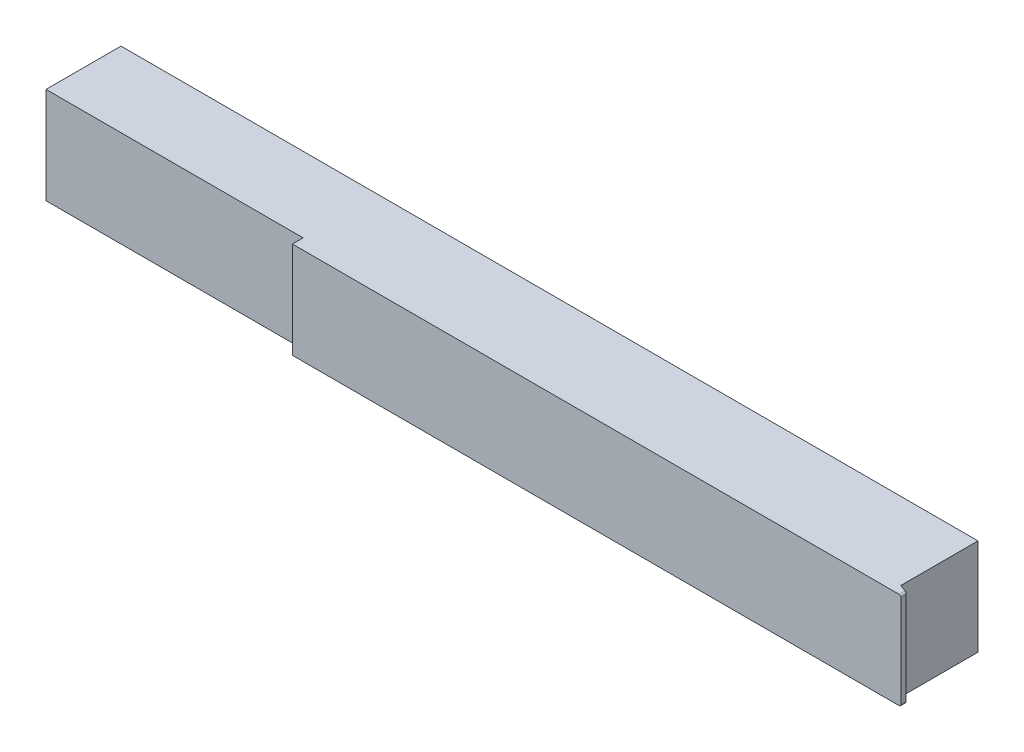
ISO-10303-21;
HEADER;
FILE_DESCRIPTION(('STEP AP214'),'2;1');
FILE_NAME('part.step','',(''),(''),'','','');
FILE_SCHEMA(('AUTOMOTIVE_DESIGN { 1 0 10303 214 1 1 1 1 }'));
ENDSEC;
DATA;
#1=APPLICATION_CONTEXT('core data for automotive mechanical design processes');
#2=APPLICATION_PROTOCOL_DEFINITION('international standard','automotive_design',2000,#1);
#3=PRODUCT_CONTEXT('',#1,'mechanical');
#4=PRODUCT('Part','Part','',(#3));
#5=PRODUCT_RELATED_PRODUCT_CATEGORY('part','',(#4));
#6=PRODUCT_DEFINITION_FORMATION('','',#4);
#7=PRODUCT_DEFINITION_CONTEXT('part definition',#1,'design');
#8=PRODUCT_DEFINITION('design','',#6,#7);
#9=PRODUCT_DEFINITION_SHAPE('','',#8);
#10=(LENGTH_UNIT() NAMED_UNIT(*) SI_UNIT(.MILLI.,.METRE.));
#11=(NAMED_UNIT(*) PLANE_ANGLE_UNIT() SI_UNIT($,.RADIAN.));
#12=(NAMED_UNIT(*) SI_UNIT($,.STERADIAN.) SOLID_ANGLE_UNIT());
#13=UNCERTAINTY_MEASURE_WITH_UNIT(LENGTH_MEASURE(1.E-05),#10,'distance_accuracy_value','');
#14=(GEOMETRIC_REPRESENTATION_CONTEXT(3) GLOBAL_UNCERTAINTY_ASSIGNED_CONTEXT((#13)) GLOBAL_UNIT_ASSIGNED_CONTEXT((#10,
#11,#12)) REPRESENTATION_CONTEXT('',''));
#15=CARTESIAN_POINT('',(0.,0.,0.));
#16=DIRECTION('',(0.,0.,1.));
#17=DIRECTION('',(1.,0.,0.));
#18=AXIS2_PLACEMENT_3D('',#15,#16,#17);
#19=CARTESIAN_POINT('',(0.,22.5,-20.));
#20=DIRECTION('',(0.,-1.,0.));
#21=DIRECTION('',(1.,0.,0.));
#22=AXIS2_PLACEMENT_3D('',#19,#20,#21);
#23=PLANE('',#22);
#24=DIRECTION('',(-1.,0.,0.));
#25=VECTOR('',#24,1.);
#26=CARTESIAN_POINT('',(60.,22.5,-2.5));
#27=LINE('',#26,#25);
#28=CARTESIAN_POINT('',(60.,22.5,-2.5));
#29=VERTEX_POINT('',#28);
#30=CARTESIAN_POINT('',(0.,22.5,-2.5));
#31=VERTEX_POINT('',#30);
#32=EDGE_CURVE('E144',#29,#31,#27,.T.);
#33=ORIENTED_EDGE('',*,*,#32,.F.);
#34=DIRECTION('',(0.,0.,-1.));
#35=VECTOR('',#34,1.);
#36=CARTESIAN_POINT('',(60.,22.5,0.));
#37=LINE('',#36,#35);
#38=CARTESIAN_POINT('',(60.,22.5,0.));
#39=VERTEX_POINT('',#38);
#40=EDGE_CURVE('E135',#39,#29,#37,.T.);
#41=ORIENTED_EDGE('',*,*,#40,.F.);
#42=DIRECTION('',(1.,0.,0.));
#43=VECTOR('',#42,1.);
#44=CARTESIAN_POINT('',(0.,22.5,0.));
#45=LINE('',#44,#43);
#46=CARTESIAN_POINT('',(201.6,22.5,0.));
#47=VERTEX_POINT('',#46);
#48=EDGE_CURVE('E165',#39,#47,#45,.T.);
#49=ORIENTED_EDGE('',*,*,#48,.T.);
#50=DIRECTION('',(0.,0.,1.));
#51=VECTOR('',#50,1.);
#52=CARTESIAN_POINT('',(201.6,22.5,-1.24999999999999));
#53=LINE('',#52,#51);
#54=CARTESIAN_POINT('',(201.6,22.5,-1.39558809370647));
#55=VERTEX_POINT('',#54);
#56=EDGE_CURVE('E11',#47,#55,#53,.F.);
#57=ORIENTED_EDGE('',*,*,#56,.T.);
#58=DIRECTION('',(0.939692620785909,0.,0.342020143325667));
#59=VECTOR('',#58,1.);
#60=CARTESIAN_POINT('',(202.,22.5,-1.24999999999999));
#61=LINE('',#60,#59);
#62=CARTESIAN_POINT('',(200.,22.5,-1.97794046853239));
#63=VERTEX_POINT('',#62);
#64=EDGE_CURVE('E197',#55,#63,#61,.F.);
#65=ORIENTED_EDGE('',*,*,#64,.T.);
#66=DIRECTION('',(0.,0.,1.));
#67=VECTOR('',#66,1.);
#68=CARTESIAN_POINT('',(200.,22.5,-20.));
#69=LINE('',#68,#67);
#70=CARTESIAN_POINT('',(200.,22.5,-20.));
#71=VERTEX_POINT('',#70);
#72=EDGE_CURVE('E158',#71,#63,#69,.T.);
#73=ORIENTED_EDGE('',*,*,#72,.F.);
#74=DIRECTION('',(1.,0.,0.));
#75=VECTOR('',#74,1.);
#76=CARTESIAN_POINT('',(0.,22.5,-20.));
#77=LINE('',#76,#75);
#78=CARTESIAN_POINT('',(0.,22.5,-20.));
#79=VERTEX_POINT('',#78);
#80=EDGE_CURVE('E170',#79,#71,#77,.T.);
#81=ORIENTED_EDGE('',*,*,#80,.F.);
#82=DIRECTION('',(0.,0.,1.));
#83=VECTOR('',#82,1.);
#84=CARTESIAN_POINT('',(0.,22.5,-20.));
#85=LINE('',#84,#83);
#86=EDGE_CURVE('E189',#79,#31,#85,.T.);
#87=ORIENTED_EDGE('',*,*,#86,.T.);
#88=EDGE_LOOP('',(#33,#41,#49,#57,#65,#73,#81,#87));
#89=FACE_BOUND('',#88,.T.);
#90=ADVANCED_FACE('F47',(#89),#23,.F.);
#91=CARTESIAN_POINT('',(202.,0.,-20.));
#92=DIRECTION('',(1.,0.,0.));
#93=DIRECTION('',(0.,0.,-1.));
#94=AXIS2_PLACEMENT_3D('',#91,#92,#93);
#95=PLANE('',#94);
#96=DIRECTION('',(0.,1.,0.));
#97=VECTOR('',#96,1.);
#98=CARTESIAN_POINT('',(202.,0.,0.));
#99=LINE('',#98,#97);
#100=CARTESIAN_POINT('',(202.,0.400000000000025,0.));
#101=VERTEX_POINT('',#100);
#102=CARTESIAN_POINT('',(202.,22.1,0.));
#103=VERTEX_POINT('',#102);
#104=EDGE_CURVE('E181',#101,#103,#99,.T.);
#105=ORIENTED_EDGE('',*,*,#104,.F.);
#106=DIRECTION('',(0.,0.,1.));
#107=VECTOR('',#106,1.);
#108=CARTESIAN_POINT('',(202.,0.400000000000025,-20.));
#109=LINE('',#108,#107);
#110=CARTESIAN_POINT('',(202.,0.400000000000025,-1.24999999999999));
#111=VERTEX_POINT('',#110);
#112=EDGE_CURVE('E222',#101,#111,#109,.F.);
#113=ORIENTED_EDGE('',*,*,#112,.T.);
#114=DIRECTION('',(0.,1.,0.));
#115=VECTOR('',#114,1.);
#116=CARTESIAN_POINT('',(202.,0.,-1.24999999999999));
#117=LINE('',#116,#115);
#118=CARTESIAN_POINT('',(202.,22.1,-1.24999999999999));
#119=VERTEX_POINT('',#118);
#120=EDGE_CURVE('E193',#111,#119,#117,.T.);
#121=ORIENTED_EDGE('',*,*,#120,.T.);
#122=DIRECTION('',(0.,0.,1.));
#123=VECTOR('',#122,1.);
#124=CARTESIAN_POINT('',(202.,22.1,0.));
#125=LINE('',#124,#123);
#126=EDGE_CURVE('E218',#119,#103,#125,.T.);
#127=ORIENTED_EDGE('',*,*,#126,.T.);
#128=EDGE_LOOP('',(#105,#113,#121,#127));
#129=FACE_BOUND('',#128,.T.);
#130=ADVANCED_FACE('F244',(#129),#95,.T.);
#131=CARTESIAN_POINT('',(0.,0.,-20.));
#132=DIRECTION('',(0.,-1.,0.));
#133=DIRECTION('',(1.,0.,0.));
#134=AXIS2_PLACEMENT_3D('',#131,#132,#133);
#135=PLANE('',#134);
#136=DIRECTION('',(0.,0.,-1.));
#137=VECTOR('',#136,1.);
#138=CARTESIAN_POINT('',(60.,0.,0.));
#139=LINE('',#138,#137);
#140=CARTESIAN_POINT('',(60.,0.,0.));
#141=VERTEX_POINT('',#140);
#142=CARTESIAN_POINT('',(60.,0.,-2.5));
#143=VERTEX_POINT('',#142);
#144=EDGE_CURVE('E63',#141,#143,#139,.T.);
#145=ORIENTED_EDGE('',*,*,#144,.T.);
#146=DIRECTION('',(-1.,0.,0.));
#147=VECTOR('',#146,1.);
#148=CARTESIAN_POINT('',(60.,0.,-2.5));
#149=LINE('',#148,#147);
#150=CARTESIAN_POINT('',(0.,0.,-2.5));
#151=VERTEX_POINT('',#150);
#152=EDGE_CURVE('E123',#143,#151,#149,.T.);
#153=ORIENTED_EDGE('',*,*,#152,.T.);
#154=DIRECTION('',(0.,0.,1.));
#155=VECTOR('',#154,1.);
#156=CARTESIAN_POINT('',(0.,0.,-20.));
#157=LINE('',#156,#155);
#158=CARTESIAN_POINT('',(0.,0.,-20.));
#159=VERTEX_POINT('',#158);
#160=EDGE_CURVE('E178',#159,#151,#157,.T.);
#161=ORIENTED_EDGE('',*,*,#160,.F.);
#162=DIRECTION('',(1.,0.,0.));
#163=VECTOR('',#162,1.);
#164=CARTESIAN_POINT('',(0.,0.,-20.));
#165=LINE('',#164,#163);
#166=CARTESIAN_POINT('',(200.,0.,-20.));
#167=VERTEX_POINT('',#166);
#168=EDGE_CURVE('E174',#159,#167,#165,.T.);
#169=ORIENTED_EDGE('',*,*,#168,.T.);
#170=DIRECTION('',(0.,0.,1.));
#171=VECTOR('',#170,1.);
#172=CARTESIAN_POINT('',(200.,0.,-20.));
#173=LINE('',#172,#171);
#174=CARTESIAN_POINT('',(200.,0.,-1.97794046853239));
#175=VERTEX_POINT('',#174);
#176=EDGE_CURVE('E155',#167,#175,#173,.T.);
#177=ORIENTED_EDGE('',*,*,#176,.T.);
#178=DIRECTION('',(-0.939692620785909,0.,-0.342020143325667));
#179=VECTOR('',#178,1.);
#180=CARTESIAN_POINT('',(17.6033774041717,0.,-68.3648819240997));
#181=LINE('',#180,#179);
#182=CARTESIAN_POINT('',(201.6,0.,-1.39558809370649));
#183=VERTEX_POINT('',#182);
#184=EDGE_CURVE('E200',#175,#183,#181,.F.);
#185=ORIENTED_EDGE('',*,*,#184,.T.);
#186=DIRECTION('',(0.,0.,1.));
#187=VECTOR('',#186,1.);
#188=CARTESIAN_POINT('',(201.6,0.,-20.));
#189=LINE('',#188,#187);
#190=CARTESIAN_POINT('',(201.6,0.,0.));
#191=VERTEX_POINT('',#190);
#192=EDGE_CURVE('E208',#183,#191,#189,.T.);
#193=ORIENTED_EDGE('',*,*,#192,.T.);
#194=DIRECTION('',(1.,0.,0.));
#195=VECTOR('',#194,1.);
#196=CARTESIAN_POINT('',(0.,0.,0.));
#197=LINE('',#196,#195);
#198=EDGE_CURVE('E142',#141,#191,#197,.T.);
#199=ORIENTED_EDGE('',*,*,#198,.F.);
#200=EDGE_LOOP('',(#145,#153,#161,#169,#177,#185,#193,#199));
#201=FACE_BOUND('',#200,.T.);
#202=ADVANCED_FACE('F140',(#201),#135,.T.);
#203=CARTESIAN_POINT('',(0.,0.,-20.));
#204=DIRECTION('',(1.,0.,0.));
#205=DIRECTION('',(0.,0.,-1.));
#206=AXIS2_PLACEMENT_3D('',#203,#204,#205);
#207=PLANE('',#206);
#208=ORIENTED_EDGE('',*,*,#160,.T.);
#209=DIRECTION('',(0.,1.,0.));
#210=VECTOR('',#209,1.);
#211=CARTESIAN_POINT('',(0.,-60.0520607473216,-2.5));
#212=LINE('',#211,#210);
#213=EDGE_CURVE('E128',#151,#31,#212,.T.);
#214=ORIENTED_EDGE('',*,*,#213,.T.);
#215=ORIENTED_EDGE('',*,*,#86,.F.);
#216=DIRECTION('',(0.,1.,0.));
#217=VECTOR('',#216,1.);
#218=CARTESIAN_POINT('',(0.,0.,-20.));
#219=LINE('',#218,#217);
#220=EDGE_CURVE('E166',#159,#79,#219,.T.);
#221=ORIENTED_EDGE('',*,*,#220,.F.);
#222=EDGE_LOOP('',(#208,#214,#215,#221));
#223=FACE_BOUND('',#222,.T.);
#224=ADVANCED_FACE('F251',(#223),#207,.F.);
#225=CARTESIAN_POINT('',(0.,0.,-20.));
#226=DIRECTION('',(0.,0.,-1.));
#227=DIRECTION('',(-1.,0.,0.));
#228=AXIS2_PLACEMENT_3D('',#225,#226,#227);
#229=PLANE('',#228);
#230=DIRECTION('',(0.,1.,0.));
#231=VECTOR('',#230,1.);
#232=CARTESIAN_POINT('',(200.,0.,-20.));
#233=LINE('',#232,#231);
#234=EDGE_CURVE('E162',#167,#71,#233,.T.);
#235=ORIENTED_EDGE('',*,*,#234,.F.);
#236=ORIENTED_EDGE('',*,*,#168,.F.);
#237=ORIENTED_EDGE('',*,*,#220,.T.);
#238=ORIENTED_EDGE('',*,*,#80,.T.);
#239=EDGE_LOOP('',(#235,#236,#237,#238));
#240=FACE_BOUND('',#239,.T.);
#241=ADVANCED_FACE('F256',(#240),#229,.T.);
#242=CARTESIAN_POINT('',(0.,0.,0.));
#243=DIRECTION('',(0.,0.,-1.));
#244=DIRECTION('',(-1.,0.,0.));
#245=AXIS2_PLACEMENT_3D('',#242,#243,#244);
#246=PLANE('',#245);
#247=ORIENTED_EDGE('',*,*,#48,.F.);
#248=DIRECTION('',(0.,1.,0.));
#249=VECTOR('',#248,1.);
#250=CARTESIAN_POINT('',(60.,-60.0520607473216,0.));
#251=LINE('',#250,#249);
#252=EDGE_CURVE('E151',#141,#39,#251,.T.);
#253=ORIENTED_EDGE('',*,*,#252,.F.);
#254=ORIENTED_EDGE('',*,*,#198,.T.);
#255=CARTESIAN_POINT('',(201.6,0.400000000000025,0.));
#256=DIRECTION('',(0.,0.,-1.));
#257=DIRECTION('',(-1.,0.,0.));
#258=AXIS2_PLACEMENT_3D('',#255,#256,#257);
#259=CIRCLE('',#258,0.4);
#260=EDGE_CURVE('E215',#191,#101,#259,.F.);
#261=ORIENTED_EDGE('',*,*,#260,.T.);
#262=ORIENTED_EDGE('',*,*,#104,.T.);
#263=CARTESIAN_POINT('',(201.6,22.1,0.));
#264=DIRECTION('',(0.,0.,-1.));
#265=DIRECTION('',(-1.,0.,0.));
#266=AXIS2_PLACEMENT_3D('',#263,#264,#265);
#267=CIRCLE('',#266,0.4);
#268=EDGE_CURVE('E211',#103,#47,#267,.F.);
#269=ORIENTED_EDGE('',*,*,#268,.T.);
#270=EDGE_LOOP('',(#247,#253,#254,#261,#262,#269));
#271=FACE_BOUND('',#270,.T.);
#272=ADVANCED_FACE('F242',(#271),#246,.F.);
#273=CARTESIAN_POINT('',(200.,0.,0.));
#274=DIRECTION('',(-1.,0.,0.));
#275=DIRECTION('',(0.,0.,1.));
#276=AXIS2_PLACEMENT_3D('',#273,#274,#275);
#277=PLANE('',#276);
#278=ORIENTED_EDGE('',*,*,#176,.F.);
#279=ORIENTED_EDGE('',*,*,#234,.T.);
#280=ORIENTED_EDGE('',*,*,#72,.T.);
#281=DIRECTION('',(0.,1.,0.));
#282=VECTOR('',#281,1.);
#283=CARTESIAN_POINT('',(200.,0.,-1.97794046853239));
#284=LINE('',#283,#282);
#285=EDGE_CURVE('E204',#63,#175,#284,.F.);
#286=ORIENTED_EDGE('',*,*,#285,.T.);
#287=EDGE_LOOP('',(#278,#279,#280,#286));
#288=FACE_BOUND('',#287,.T.);
#289=ADVANCED_FACE('F259',(#288),#277,.F.);
#290=CARTESIAN_POINT('',(202.,0.,-1.24999999999999));
#291=DIRECTION('',(-0.342020143325667,0.,0.939692620785909));
#292=DIRECTION('',(0.,1.,0.));
#293=AXIS2_PLACEMENT_3D('',#290,#291,#292);
#294=PLANE('',#293);
#295=ORIENTED_EDGE('',*,*,#120,.F.);
#296=CARTESIAN_POINT('',(201.6,0.400000000000025,-1.39558809370647));
#297=DIRECTION('',(-0.342020143325667,0.,0.939692620785909));
#298=DIRECTION('',(0.939692620785909,0.,0.342020143325667));
#299=AXIS2_PLACEMENT_3D('',#296,#297,#298);
#300=ELLIPSE('',#299,0.425671108990365,0.4);
#301=EDGE_CURVE('E56',#111,#183,#300,.F.);
#302=ORIENTED_EDGE('',*,*,#301,.T.);
#303=ORIENTED_EDGE('',*,*,#184,.F.);
#304=ORIENTED_EDGE('',*,*,#285,.F.);
#305=ORIENTED_EDGE('',*,*,#64,.F.);
#306=CARTESIAN_POINT('',(201.6,22.1,-1.39558809370647));
#307=DIRECTION('',(-0.342020143325667,0.,0.939692620785909));
#308=DIRECTION('',(-0.939692620785909,0.,-0.342020143325667));
#309=AXIS2_PLACEMENT_3D('',#306,#307,#308);
#310=ELLIPSE('',#309,0.425671108990365,0.4);
#311=EDGE_CURVE('E225',#55,#119,#310,.F.);
#312=ORIENTED_EDGE('',*,*,#311,.T.);
#313=EDGE_LOOP('',(#295,#302,#303,#304,#305,#312));
#314=FACE_BOUND('',#313,.T.);
#315=ADVANCED_FACE('F232',(#314),#294,.F.);
#316=CARTESIAN_POINT('',(201.6,0.400000000000025,-20.));
#317=DIRECTION('',(0.,0.,1.));
#318=DIRECTION('',(1.,0.,0.));
#319=AXIS2_PLACEMENT_3D('',#316,#317,#318);
#320=CYLINDRICAL_SURFACE('',#319,0.4);
#321=ORIENTED_EDGE('',*,*,#301,.F.);
#322=ORIENTED_EDGE('',*,*,#112,.F.);
#323=ORIENTED_EDGE('',*,*,#260,.F.);
#324=ORIENTED_EDGE('',*,*,#192,.F.);
#325=EDGE_LOOP('',(#321,#322,#323,#324));
#326=FACE_BOUND('',#325,.T.);
#327=ADVANCED_FACE('F238',(#326),#320,.T.);
#328=CARTESIAN_POINT('',(201.6,22.1,-20.));
#329=DIRECTION('',(0.,0.,-1.));
#330=DIRECTION('',(-1.,0.,0.));
#331=AXIS2_PLACEMENT_3D('',#328,#329,#330);
#332=CYLINDRICAL_SURFACE('',#331,0.4);
#333=ORIENTED_EDGE('',*,*,#311,.F.);
#334=ORIENTED_EDGE('',*,*,#56,.F.);
#335=ORIENTED_EDGE('',*,*,#268,.F.);
#336=ORIENTED_EDGE('',*,*,#126,.F.);
#337=EDGE_LOOP('',(#333,#334,#335,#336));
#338=FACE_BOUND('',#337,.T.);
#339=ADVANCED_FACE('F49',(#338),#332,.T.);
#340=CARTESIAN_POINT('',(60.,-60.0520607473216,0.));
#341=DIRECTION('',(1.,0.,0.));
#342=DIRECTION('',(0.,1.,0.));
#343=AXIS2_PLACEMENT_3D('',#340,#341,#342);
#344=PLANE('',#343);
#345=ORIENTED_EDGE('',*,*,#252,.T.);
#346=ORIENTED_EDGE('',*,*,#40,.T.);
#347=DIRECTION('',(0.,1.,0.));
#348=VECTOR('',#347,1.);
#349=CARTESIAN_POINT('',(60.,-60.0520607473216,-2.5));
#350=LINE('',#349,#348);
#351=EDGE_CURVE('E125',#143,#29,#350,.T.);
#352=ORIENTED_EDGE('',*,*,#351,.F.);
#353=ORIENTED_EDGE('',*,*,#144,.F.);
#354=EDGE_LOOP('',(#345,#346,#352,#353));
#355=FACE_BOUND('',#354,.T.);
#356=ADVANCED_FACE('F133',(#355),#344,.F.);
#357=CARTESIAN_POINT('',(60.,-60.0520607473216,-2.5));
#358=DIRECTION('',(0.,0.,-1.));
#359=DIRECTION('',(-1.,0.,0.));
#360=AXIS2_PLACEMENT_3D('',#357,#358,#359);
#361=PLANE('',#360);
#362=ORIENTED_EDGE('',*,*,#351,.T.);
#363=ORIENTED_EDGE('',*,*,#32,.T.);
#364=ORIENTED_EDGE('',*,*,#213,.F.);
#365=ORIENTED_EDGE('',*,*,#152,.F.);
#366=EDGE_LOOP('',(#362,#363,#364,#365));
#367=FACE_BOUND('',#366,.T.);
#368=ADVANCED_FACE('F124',(#367),#361,.F.);
#369=CLOSED_SHELL('',(#90,#130,#202,#224,#241,#272,#289,#315,#327,#339,#356,#368));
#370=MANIFOLD_SOLID_BREP('B2',#369);
#371=ADVANCED_BREP_SHAPE_REPRESENTATION('',(#18,#370),#14);
#372=SHAPE_DEFINITION_REPRESENTATION(#9,#371);
ENDSEC;
END-ISO-10303-21;
